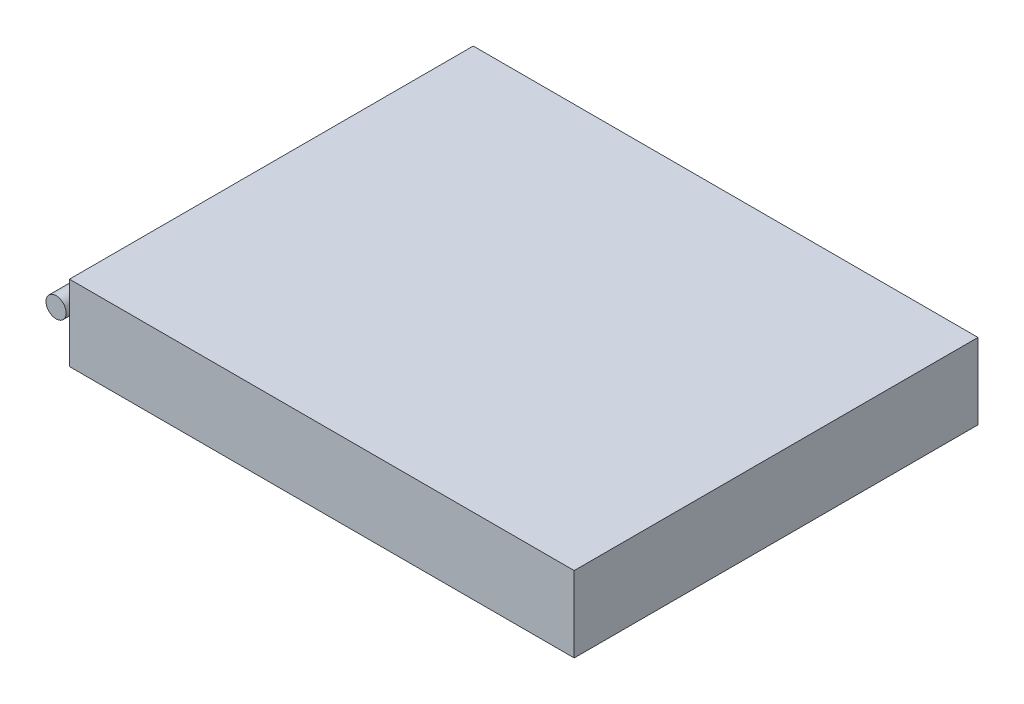
ISO-10303-21;
HEADER;
FILE_DESCRIPTION(('STEP AP214'),'2;1');
FILE_NAME('part.step','',(''),(''),'','','');
FILE_SCHEMA(('AUTOMOTIVE_DESIGN { 1 0 10303 214 1 1 1 1 }'));
ENDSEC;
DATA;
#1=APPLICATION_CONTEXT('core data for automotive mechanical design processes');
#2=APPLICATION_PROTOCOL_DEFINITION('international standard','automotive_design',2000,#1);
#3=PRODUCT_CONTEXT('',#1,'mechanical');
#4=PRODUCT('Part','Part','',(#3));
#5=PRODUCT_RELATED_PRODUCT_CATEGORY('part','',(#4));
#6=PRODUCT_DEFINITION_FORMATION('','',#4);
#7=PRODUCT_DEFINITION_CONTEXT('part definition',#1,'design');
#8=PRODUCT_DEFINITION('design','',#6,#7);
#9=PRODUCT_DEFINITION_SHAPE('','',#8);
#10=(LENGTH_UNIT() NAMED_UNIT(*) SI_UNIT(.MILLI.,.METRE.));
#11=(NAMED_UNIT(*) PLANE_ANGLE_UNIT() SI_UNIT($,.RADIAN.));
#12=(NAMED_UNIT(*) SI_UNIT($,.STERADIAN.) SOLID_ANGLE_UNIT());
#13=UNCERTAINTY_MEASURE_WITH_UNIT(LENGTH_MEASURE(1.E-05),#10,'distance_accuracy_value','');
#14=(GEOMETRIC_REPRESENTATION_CONTEXT(3) GLOBAL_UNCERTAINTY_ASSIGNED_CONTEXT((#13)) GLOBAL_UNIT_ASSIGNED_CONTEXT((#10,
#11,#12)) REPRESENTATION_CONTEXT('',''));
#15=CARTESIAN_POINT('',(0.,0.,0.));
#16=DIRECTION('',(0.,0.,1.));
#17=DIRECTION('',(1.,0.,0.));
#18=AXIS2_PLACEMENT_3D('',#15,#16,#17);
#19=CARTESIAN_POINT('',(0.,7.5,0.));
#20=DIRECTION('',(1.,0.,0.));
#21=DIRECTION('',(0.,0.,-1.));
#22=AXIS2_PLACEMENT_3D('',#19,#20,#21);
#23=PLANE('',#22);
#24=CARTESIAN_POINT('',(0.,3.75,-35.000000005));
#25=DIRECTION('',(-1.,0.,0.));
#26=DIRECTION('',(0.,0.,1.));
#27=AXIS2_PLACEMENT_3D('',#24,#25,#26);
#28=CIRCLE('',#27,0.999999999999998);
#29=CARTESIAN_POINT('',(0.,3.75,-34.000000005));
#30=VERTEX_POINT('',#29);
#31=EDGE_CURVE('E41',#30,#30,#28,.T.);
#32=ORIENTED_EDGE('',*,*,#31,.F.);
#33=EDGE_LOOP('',(#32));
#34=FACE_BOUND('',#33,.T.);
#35=DIRECTION('',(0.,0.,1.));
#36=VECTOR('',#35,1.);
#37=CARTESIAN_POINT('',(0.,0.,0.));
#38=LINE('',#37,#36);
#39=CARTESIAN_POINT('',(0.,0.,-40.00000001));
#40=VERTEX_POINT('',#39);
#41=CARTESIAN_POINT('',(0.,0.,0.));
#42=VERTEX_POINT('',#41);
#43=EDGE_CURVE('E99',#40,#42,#38,.T.);
#44=ORIENTED_EDGE('',*,*,#43,.T.);
#45=DIRECTION('',(0.,-1.,0.));
#46=VECTOR('',#45,1.);
#47=CARTESIAN_POINT('',(0.,7.5,0.));
#48=LINE('',#47,#46);
#49=CARTESIAN_POINT('',(0.,7.5,0.));
#50=VERTEX_POINT('',#49);
#51=EDGE_CURVE('E35',#50,#42,#48,.T.);
#52=ORIENTED_EDGE('',*,*,#51,.F.);
#53=DIRECTION('',(0.,0.,1.));
#54=VECTOR('',#53,1.);
#55=CARTESIAN_POINT('',(0.,7.5,0.));
#56=LINE('',#55,#54);
#57=CARTESIAN_POINT('',(0.,7.5,-40.00000001));
#58=VERTEX_POINT('',#57);
#59=EDGE_CURVE('E86',#58,#50,#56,.T.);
#60=ORIENTED_EDGE('',*,*,#59,.F.);
#61=DIRECTION('',(0.,-1.,0.));
#62=VECTOR('',#61,1.);
#63=CARTESIAN_POINT('',(0.,7.5,-40.00000001));
#64=LINE('',#63,#62);
#65=EDGE_CURVE('E95',#58,#40,#64,.T.);
#66=ORIENTED_EDGE('',*,*,#65,.T.);
#67=EDGE_LOOP('',(#44,#52,#60,#66));
#68=FACE_BOUND('',#67,.T.);
#69=CARTESIAN_POINT('',(0.,3.75,-5.));
#70=DIRECTION('',(-1.,0.,0.));
#71=DIRECTION('',(0.,0.,1.));
#72=AXIS2_PLACEMENT_3D('',#69,#70,#71);
#73=CIRCLE('',#72,1.);
#74=CARTESIAN_POINT('',(0.,3.75,-4.));
#75=VERTEX_POINT('',#74);
#76=EDGE_CURVE('E11',#75,#75,#73,.T.);
#77=ORIENTED_EDGE('',*,*,#76,.F.);
#78=EDGE_LOOP('',(#77));
#79=FACE_BOUND('',#78,.T.);
#80=ADVANCED_FACE('F32',(#34,#68,#79),#23,.F.);
#81=CARTESIAN_POINT('',(0.,7.5,0.));
#82=DIRECTION('',(0.,0.,-1.));
#83=DIRECTION('',(-1.,0.,0.));
#84=AXIS2_PLACEMENT_3D('',#81,#82,#83);
#85=PLANE('',#84);
#86=DIRECTION('',(1.,0.,0.));
#87=VECTOR('',#86,1.);
#88=CARTESIAN_POINT('',(0.,0.,0.));
#89=LINE('',#88,#87);
#90=CARTESIAN_POINT('',(50.,0.,0.));
#91=VERTEX_POINT('',#90);
#92=EDGE_CURVE('E91',#42,#91,#89,.T.);
#93=ORIENTED_EDGE('',*,*,#92,.T.);
#94=DIRECTION('',(0.,-1.,0.));
#95=VECTOR('',#94,1.);
#96=CARTESIAN_POINT('',(50.,7.5,0.));
#97=LINE('',#96,#95);
#98=CARTESIAN_POINT('',(50.,7.5,0.));
#99=VERTEX_POINT('',#98);
#100=EDGE_CURVE('E89',#99,#91,#97,.T.);
#101=ORIENTED_EDGE('',*,*,#100,.F.);
#102=DIRECTION('',(1.,0.,0.));
#103=VECTOR('',#102,1.);
#104=CARTESIAN_POINT('',(0.,7.5,0.));
#105=LINE('',#104,#103);
#106=EDGE_CURVE('E81',#50,#99,#105,.T.);
#107=ORIENTED_EDGE('',*,*,#106,.F.);
#108=ORIENTED_EDGE('',*,*,#51,.T.);
#109=EDGE_LOOP('',(#93,#101,#107,#108));
#110=FACE_BOUND('',#109,.T.);
#111=ADVANCED_FACE('F90',(#110),#85,.F.);
#112=CARTESIAN_POINT('',(50.,7.5,0.));
#113=DIRECTION('',(-1.,0.,0.));
#114=DIRECTION('',(0.,0.,1.));
#115=AXIS2_PLACEMENT_3D('',#112,#113,#114);
#116=PLANE('',#115);
#117=DIRECTION('',(0.,0.,-1.));
#118=VECTOR('',#117,1.);
#119=CARTESIAN_POINT('',(50.,0.,0.));
#120=LINE('',#119,#118);
#121=CARTESIAN_POINT('',(50.,0.,-40.00000001));
#122=VERTEX_POINT('',#121);
#123=EDGE_CURVE('E67',#91,#122,#120,.T.);
#124=ORIENTED_EDGE('',*,*,#123,.T.);
#125=DIRECTION('',(0.,-1.,0.));
#126=VECTOR('',#125,1.);
#127=CARTESIAN_POINT('',(50.,7.5,-40.00000001));
#128=LINE('',#127,#126);
#129=CARTESIAN_POINT('',(50.,7.5,-40.00000001));
#130=VERTEX_POINT('',#129);
#131=EDGE_CURVE('E92',#130,#122,#128,.T.);
#132=ORIENTED_EDGE('',*,*,#131,.F.);
#133=DIRECTION('',(0.,0.,-1.));
#134=VECTOR('',#133,1.);
#135=CARTESIAN_POINT('',(50.,7.5,0.));
#136=LINE('',#135,#134);
#137=EDGE_CURVE('E84',#99,#130,#136,.T.);
#138=ORIENTED_EDGE('',*,*,#137,.F.);
#139=ORIENTED_EDGE('',*,*,#100,.T.);
#140=EDGE_LOOP('',(#124,#132,#138,#139));
#141=FACE_BOUND('',#140,.T.);
#142=ADVANCED_FACE('F93',(#141),#116,.F.);
#143=CARTESIAN_POINT('',(0.,7.5,-40.00000001));
#144=DIRECTION('',(0.,0.,1.));
#145=DIRECTION('',(1.,0.,0.));
#146=AXIS2_PLACEMENT_3D('',#143,#144,#145);
#147=PLANE('',#146);
#148=DIRECTION('',(-1.,0.,0.));
#149=VECTOR('',#148,1.);
#150=CARTESIAN_POINT('',(0.,0.,-40.00000001));
#151=LINE('',#150,#149);
#152=EDGE_CURVE('E73',#122,#40,#151,.T.);
#153=ORIENTED_EDGE('',*,*,#152,.T.);
#154=ORIENTED_EDGE('',*,*,#65,.F.);
#155=DIRECTION('',(-1.,0.,0.));
#156=VECTOR('',#155,1.);
#157=CARTESIAN_POINT('',(0.,7.5,-40.00000001));
#158=LINE('',#157,#156);
#159=EDGE_CURVE('E50',#130,#58,#158,.T.);
#160=ORIENTED_EDGE('',*,*,#159,.F.);
#161=ORIENTED_EDGE('',*,*,#131,.T.);
#162=EDGE_LOOP('',(#153,#154,#160,#161));
#163=FACE_BOUND('',#162,.T.);
#164=ADVANCED_FACE('F107',(#163),#147,.F.);
#165=CARTESIAN_POINT('',(0.,7.5,0.));
#166=DIRECTION('',(0.,-1.,0.));
#167=DIRECTION('',(0.,0.,-1.));
#168=AXIS2_PLACEMENT_3D('',#165,#166,#167);
#169=PLANE('',#168);
#170=ORIENTED_EDGE('',*,*,#59,.T.);
#171=ORIENTED_EDGE('',*,*,#106,.T.);
#172=ORIENTED_EDGE('',*,*,#137,.T.);
#173=ORIENTED_EDGE('',*,*,#159,.T.);
#174=EDGE_LOOP('',(#170,#171,#172,#173));
#175=FACE_BOUND('',#174,.T.);
#176=ADVANCED_FACE('F82',(#175),#169,.F.);
#177=CARTESIAN_POINT('',(0.,0.,0.));
#178=DIRECTION('',(0.,-1.,0.));
#179=DIRECTION('',(0.,0.,-1.));
#180=AXIS2_PLACEMENT_3D('',#177,#178,#179);
#181=PLANE('',#180);
#182=ORIENTED_EDGE('',*,*,#43,.F.);
#183=ORIENTED_EDGE('',*,*,#152,.F.);
#184=ORIENTED_EDGE('',*,*,#123,.F.);
#185=ORIENTED_EDGE('',*,*,#92,.F.);
#186=EDGE_LOOP('',(#182,#183,#184,#185));
#187=FACE_BOUND('',#186,.T.);
#188=ADVANCED_FACE('F110',(#187),#181,.T.);
#189=CARTESIAN_POINT('',(-2.,3.75,-33.500000005));
#190=DIRECTION('',(0.,0.,1.));
#191=DIRECTION('',(1.,0.,0.));
#192=AXIS2_PLACEMENT_3D('',#189,#190,#191);
#193=CYLINDRICAL_SURFACE('',#192,0.999999999999998);
#194=CARTESIAN_POINT('',(-2.,3.75,-33.500000005));
#195=DIRECTION('',(0.,0.,1.));
#196=DIRECTION('',(1.,0.,0.));
#197=AXIS2_PLACEMENT_3D('',#194,#195,#196);
#198=CIRCLE('',#197,0.999999999999998);
#199=CARTESIAN_POINT('',(-3.,3.75,-33.500000005));
#200=VERTEX_POINT('',#199);
#201=EDGE_CURVE('E116',#200,#200,#198,.T.);
#202=ORIENTED_EDGE('',*,*,#201,.T.);
#203=EDGE_LOOP('',(#202));
#204=FACE_BOUND('',#203,.T.);
#205=CARTESIAN_POINT('',(-2.,3.75,-10.000000005));
#206=DIRECTION('',(0.,0.,1.));
#207=DIRECTION('',(1.,0.,0.));
#208=AXIS2_PLACEMENT_3D('',#205,#206,#207);
#209=CIRCLE('',#208,0.999999999999998);
#210=CARTESIAN_POINT('',(-1.,3.75,-10.000000005));
#211=VERTEX_POINT('',#210);
#212=EDGE_CURVE('E102',#211,#211,#209,.T.);
#213=ORIENTED_EDGE('',*,*,#212,.F.);
#214=EDGE_LOOP('',(#213));
#215=FACE_BOUND('',#214,.T.);
#216=ADVANCED_FACE('F163',(#204,#215),#193,.T.);
#217=CARTESIAN_POINT('',(-0.5,3.75,-33.500000005));
#218=DIRECTION('',(0.,1.,0.));
#219=DIRECTION('',(0.,0.,1.));
#220=AXIS2_PLACEMENT_3D('',#217,#218,#219);
#221=TOROIDAL_SURFACE('',#220,1.5,0.999999999999998);
#222=CARTESIAN_POINT('',(-0.5,3.75,-35.000000005));
#223=DIRECTION('',(-1.,0.,0.));
#224=DIRECTION('',(0.,0.,1.));
#225=AXIS2_PLACEMENT_3D('',#222,#223,#224);
#226=CIRCLE('',#225,0.999999999999998);
#227=CARTESIAN_POINT('',(-0.5,3.75,-36.000000005));
#228=VERTEX_POINT('',#227);
#229=EDGE_CURVE('E119',#228,#228,#226,.T.);
#230=CARTESIAN_POINT('',(-0.5,3.75,-33.500000005));
#231=DIRECTION('',(0.,1.,0.));
#232=DIRECTION('',(0.,0.,1.));
#233=AXIS2_PLACEMENT_3D('',#230,#231,#232);
#234=CIRCLE('',#233,2.5);
#235=EDGE_CURVE('',#228,#200,#234,.T.);
#236=ORIENTED_EDGE('',*,*,#229,.T.);
#237=ORIENTED_EDGE('',*,*,#201,.F.);
#238=ORIENTED_EDGE('',*,*,#235,.T.);
#239=ORIENTED_EDGE('',*,*,#235,.F.);
#240=EDGE_LOOP('',(#236,#238,#237,#239));
#241=FACE_BOUND('',#240,.T.);
#242=ADVANCED_FACE('F153',(#241),#221,.T.);
#243=CARTESIAN_POINT('',(-0.5,3.75,-35.000000005));
#244=DIRECTION('',(1.,0.,0.));
#245=DIRECTION('',(0.,0.,-1.));
#246=AXIS2_PLACEMENT_3D('',#243,#244,#245);
#247=CYLINDRICAL_SURFACE('',#246,0.999999999999998);
#248=ORIENTED_EDGE('',*,*,#229,.F.);
#249=EDGE_LOOP('',(#248));
#250=FACE_BOUND('',#249,.T.);
#251=ORIENTED_EDGE('',*,*,#31,.T.);
#252=EDGE_LOOP('',(#251));
#253=FACE_BOUND('',#252,.T.);
#254=ADVANCED_FACE('F150',(#250,#253),#247,.T.);
#255=CARTESIAN_POINT('',(-2.,3.75,-10.000000005));
#256=DIRECTION('',(0.,0.,1.));
#257=DIRECTION('',(1.,0.,0.));
#258=AXIS2_PLACEMENT_3D('',#255,#256,#257);
#259=PLANE('',#258);
#260=ORIENTED_EDGE('',*,*,#212,.T.);
#261=EDGE_LOOP('',(#260));
#262=FACE_BOUND('',#261,.T.);
#263=ADVANCED_FACE('F152',(#262),#259,.T.);
#264=CARTESIAN_POINT('',(-2.,3.75,-3.5));
#265=DIRECTION('',(0.,0.,1.));
#266=DIRECTION('',(1.,0.,0.));
#267=AXIS2_PLACEMENT_3D('',#264,#265,#266);
#268=CYLINDRICAL_SURFACE('',#267,1.);
#269=CARTESIAN_POINT('',(-2.,3.75,-3.5));
#270=DIRECTION('',(0.,0.,1.));
#271=DIRECTION('',(1.,0.,0.));
#272=AXIS2_PLACEMENT_3D('',#269,#270,#271);
#273=CIRCLE('',#272,1.);
#274=CARTESIAN_POINT('',(-3.,3.75,-3.5));
#275=VERTEX_POINT('',#274);
#276=EDGE_CURVE('E127',#275,#275,#273,.T.);
#277=ORIENTED_EDGE('',*,*,#276,.T.);
#278=EDGE_LOOP('',(#277));
#279=FACE_BOUND('',#278,.T.);
#280=CARTESIAN_POINT('',(-2.,3.75,-0.674549329239744));
#281=DIRECTION('',(0.,0.,1.));
#282=DIRECTION('',(1.,0.,0.));
#283=AXIS2_PLACEMENT_3D('',#280,#281,#282);
#284=CIRCLE('',#283,1.);
#285=CARTESIAN_POINT('',(-1.,3.75,-0.674549329239744));
#286=VERTEX_POINT('',#285);
#287=EDGE_CURVE('E124',#286,#286,#284,.T.);
#288=ORIENTED_EDGE('',*,*,#287,.F.);
#289=EDGE_LOOP('',(#288));
#290=FACE_BOUND('',#289,.T.);
#291=ADVANCED_FACE('F160',(#279,#290),#268,.T.);
#292=CARTESIAN_POINT('',(-0.5,3.75,-3.5));
#293=DIRECTION('',(0.,1.,0.));
#294=DIRECTION('',(0.,0.,1.));
#295=AXIS2_PLACEMENT_3D('',#292,#293,#294);
#296=TOROIDAL_SURFACE('',#295,1.5,1.);
#297=CARTESIAN_POINT('',(-0.5,3.75,-5.));
#298=DIRECTION('',(-1.,0.,0.));
#299=DIRECTION('',(0.,0.,1.));
#300=AXIS2_PLACEMENT_3D('',#297,#298,#299);
#301=CIRCLE('',#300,1.);
#302=CARTESIAN_POINT('',(-0.5,3.75,-6.));
#303=VERTEX_POINT('',#302);
#304=EDGE_CURVE('E129',#303,#303,#301,.T.);
#305=CARTESIAN_POINT('',(-0.5,3.75,-3.5));
#306=DIRECTION('',(0.,1.,0.));
#307=DIRECTION('',(0.,0.,1.));
#308=AXIS2_PLACEMENT_3D('',#305,#306,#307);
#309=CIRCLE('',#308,2.5);
#310=EDGE_CURVE('',#303,#275,#309,.T.);
#311=ORIENTED_EDGE('',*,*,#304,.T.);
#312=ORIENTED_EDGE('',*,*,#276,.F.);
#313=ORIENTED_EDGE('',*,*,#310,.T.);
#314=ORIENTED_EDGE('',*,*,#310,.F.);
#315=EDGE_LOOP('',(#311,#313,#312,#314));
#316=FACE_BOUND('',#315,.T.);
#317=ADVANCED_FACE('F134',(#316),#296,.T.);
#318=CARTESIAN_POINT('',(-0.5,3.75,-5.));
#319=DIRECTION('',(1.,0.,0.));
#320=DIRECTION('',(0.,0.,-1.));
#321=AXIS2_PLACEMENT_3D('',#318,#319,#320);
#322=CYLINDRICAL_SURFACE('',#321,1.);
#323=ORIENTED_EDGE('',*,*,#304,.F.);
#324=EDGE_LOOP('',(#323));
#325=FACE_BOUND('',#324,.T.);
#326=ORIENTED_EDGE('',*,*,#76,.T.);
#327=EDGE_LOOP('',(#326));
#328=FACE_BOUND('',#327,.T.);
#329=ADVANCED_FACE('F137',(#325,#328),#322,.T.);
#330=CARTESIAN_POINT('',(-2.,3.75,-0.674549329239744));
#331=DIRECTION('',(0.,0.,1.));
#332=DIRECTION('',(1.,0.,0.));
#333=AXIS2_PLACEMENT_3D('',#330,#331,#332);
#334=PLANE('',#333);
#335=ORIENTED_EDGE('',*,*,#287,.T.);
#336=EDGE_LOOP('',(#335));
#337=FACE_BOUND('',#336,.T.);
#338=ADVANCED_FACE('F140',(#337),#334,.T.);
#339=CLOSED_SHELL('',(#80,#111,#142,#164,#176,#188,#216,#242,#254,#263,#291,#317,#329,#338));
#340=MANIFOLD_SOLID_BREP('B2',#339);
#341=ADVANCED_BREP_SHAPE_REPRESENTATION('',(#18,#340),#14);
#342=SHAPE_DEFINITION_REPRESENTATION(#9,#341);
ENDSEC;
END-ISO-10303-21;
